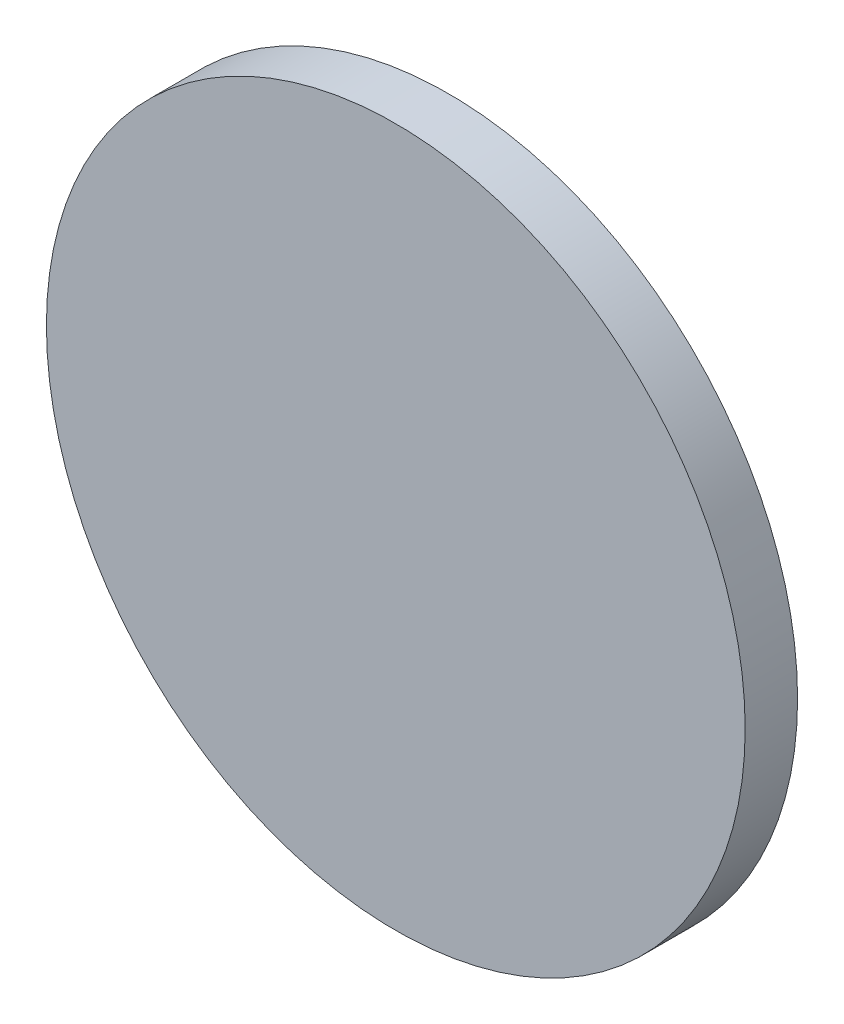
ISO-10303-21;
HEADER;
FILE_DESCRIPTION(('STEP AP214'),'2;1');
FILE_NAME('part.step','',(''),(''),'','','');
FILE_SCHEMA(('AUTOMOTIVE_DESIGN { 1 0 10303 214 1 1 1 1 }'));
ENDSEC;
DATA;
#1=APPLICATION_CONTEXT('core data for automotive mechanical design processes');
#2=APPLICATION_PROTOCOL_DEFINITION('international standard','automotive_design',2000,#1);
#3=PRODUCT_CONTEXT('',#1,'mechanical');
#4=PRODUCT('Part','Part','',(#3));
#5=PRODUCT_RELATED_PRODUCT_CATEGORY('part','',(#4));
#6=PRODUCT_DEFINITION_FORMATION('','',#4);
#7=PRODUCT_DEFINITION_CONTEXT('part definition',#1,'design');
#8=PRODUCT_DEFINITION('design','',#6,#7);
#9=PRODUCT_DEFINITION_SHAPE('','',#8);
#10=(LENGTH_UNIT() NAMED_UNIT(*) SI_UNIT(.MILLI.,.METRE.));
#11=(NAMED_UNIT(*) PLANE_ANGLE_UNIT() SI_UNIT($,.RADIAN.));
#12=(NAMED_UNIT(*) SI_UNIT($,.STERADIAN.) SOLID_ANGLE_UNIT());
#13=UNCERTAINTY_MEASURE_WITH_UNIT(LENGTH_MEASURE(1.E-05),#10,'distance_accuracy_value','');
#14=(GEOMETRIC_REPRESENTATION_CONTEXT(3) GLOBAL_UNCERTAINTY_ASSIGNED_CONTEXT((#13)) GLOBAL_UNIT_ASSIGNED_CONTEXT((#10,
#11,#12)) REPRESENTATION_CONTEXT('',''));
#15=CARTESIAN_POINT('',(0.,0.,0.));
#16=DIRECTION('',(0.,0.,1.));
#17=DIRECTION('',(1.,0.,0.));
#18=AXIS2_PLACEMENT_3D('',#15,#16,#17);
#19=CARTESIAN_POINT('',(0.,0.,6.));
#20=DIRECTION('',(0.,0.,-1.));
#21=DIRECTION('',(-1.,0.,0.));
#22=AXIS2_PLACEMENT_3D('',#19,#20,#21);
#23=CYLINDRICAL_SURFACE('',#22,40.);
#24=CARTESIAN_POINT('',(0.,0.,6.));
#25=DIRECTION('',(0.,0.,1.));
#26=DIRECTION('',(1.,0.,0.));
#27=AXIS2_PLACEMENT_3D('',#24,#25,#26);
#28=CIRCLE('',#27,40.);
#29=CARTESIAN_POINT('',(40.,0.,6.));
#30=VERTEX_POINT('',#29);
#31=EDGE_CURVE('E10',#30,#30,#28,.T.);
#32=ORIENTED_EDGE('',*,*,#31,.F.);
#33=EDGE_LOOP('',(#32));
#34=FACE_BOUND('',#33,.T.);
#35=CARTESIAN_POINT('',(0.,0.,0.));
#36=DIRECTION('',(0.,0.,1.));
#37=DIRECTION('',(1.,0.,0.));
#38=AXIS2_PLACEMENT_3D('',#35,#36,#37);
#39=CIRCLE('',#38,40.);
#40=CARTESIAN_POINT('',(40.,0.,0.));
#41=VERTEX_POINT('',#40);
#42=EDGE_CURVE('E34',#41,#41,#39,.T.);
#43=ORIENTED_EDGE('',*,*,#42,.T.);
#44=EDGE_LOOP('',(#43));
#45=FACE_BOUND('',#44,.T.);
#46=ADVANCED_FACE('F31',(#34,#45),#23,.T.);
#47=CARTESIAN_POINT('',(0.,0.,6.));
#48=DIRECTION('',(0.,0.,1.));
#49=DIRECTION('',(1.,0.,0.));
#50=AXIS2_PLACEMENT_3D('',#47,#48,#49);
#51=PLANE('',#50);
#52=ORIENTED_EDGE('',*,*,#31,.T.);
#53=EDGE_LOOP('',(#52));
#54=FACE_BOUND('',#53,.T.);
#55=ADVANCED_FACE('F46',(#54),#51,.T.);
#56=CARTESIAN_POINT('',(0.,0.,0.));
#57=DIRECTION('',(0.,0.,1.));
#58=DIRECTION('',(1.,0.,0.));
#59=AXIS2_PLACEMENT_3D('',#56,#57,#58);
#60=PLANE('',#59);
#61=ORIENTED_EDGE('',*,*,#42,.F.);
#62=EDGE_LOOP('',(#61));
#63=FACE_BOUND('',#62,.T.);
#64=ADVANCED_FACE('F44',(#63),#60,.F.);
#65=CLOSED_SHELL('',(#46,#55,#64));
#66=MANIFOLD_SOLID_BREP('B2',#65);
#67=ADVANCED_BREP_SHAPE_REPRESENTATION('',(#18,#66),#14);
#68=SHAPE_DEFINITION_REPRESENTATION(#9,#67);
ENDSEC;
END-ISO-10303-21;
